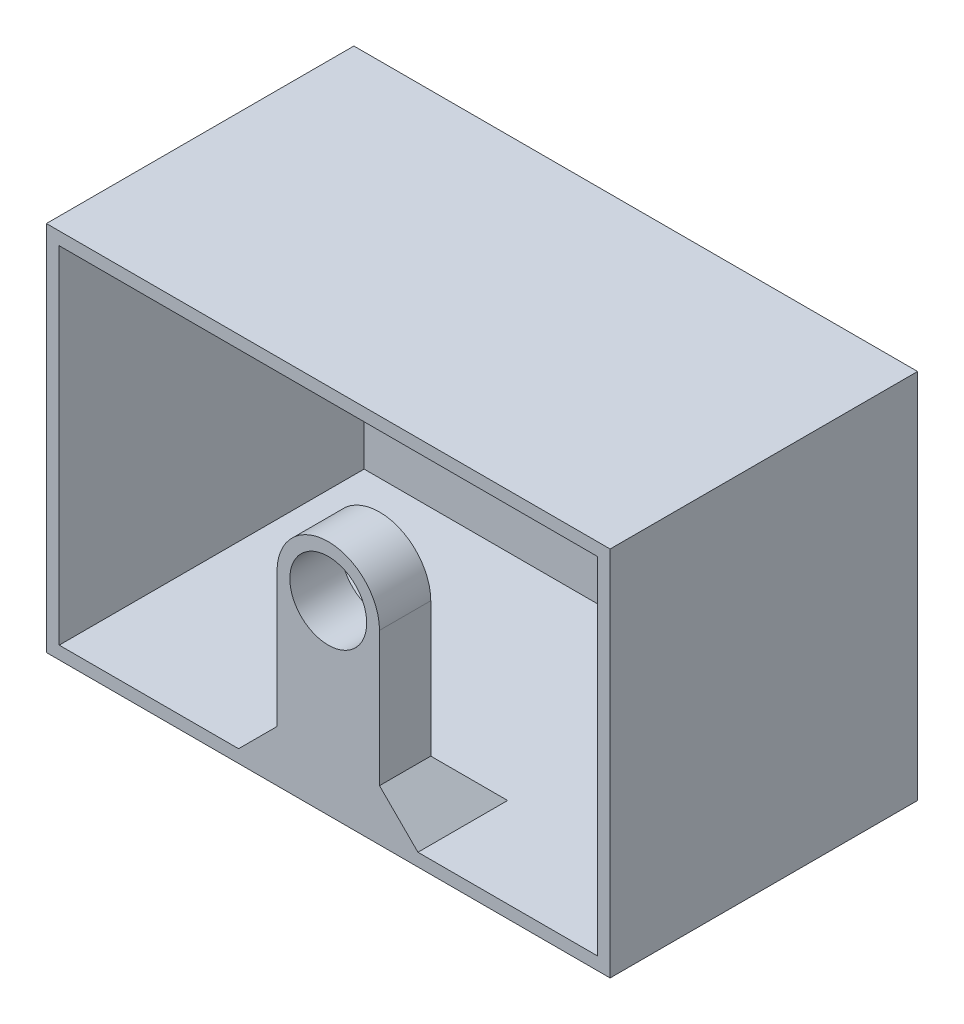
ISO-10303-21;
HEADER;
FILE_DESCRIPTION(('STEP AP214'),'2;1');
FILE_NAME('part.step','',(''),(''),'','','');
FILE_SCHEMA(('AUTOMOTIVE_DESIGN { 1 0 10303 214 1 1 1 1 }'));
ENDSEC;
DATA;
#1=APPLICATION_CONTEXT('core data for automotive mechanical design processes');
#2=APPLICATION_PROTOCOL_DEFINITION('international standard','automotive_design',2000,#1);
#3=PRODUCT_CONTEXT('',#1,'mechanical');
#4=PRODUCT('Part','Part','',(#3));
#5=PRODUCT_RELATED_PRODUCT_CATEGORY('part','',(#4));
#6=PRODUCT_DEFINITION_FORMATION('','',#4);
#7=PRODUCT_DEFINITION_CONTEXT('part definition',#1,'design');
#8=PRODUCT_DEFINITION('design','',#6,#7);
#9=PRODUCT_DEFINITION_SHAPE('','',#8);
#10=(LENGTH_UNIT() NAMED_UNIT(*) SI_UNIT(.MILLI.,.METRE.));
#11=(NAMED_UNIT(*) PLANE_ANGLE_UNIT() SI_UNIT($,.RADIAN.));
#12=(NAMED_UNIT(*) SI_UNIT($,.STERADIAN.) SOLID_ANGLE_UNIT());
#13=UNCERTAINTY_MEASURE_WITH_UNIT(LENGTH_MEASURE(1.E-05),#10,'distance_accuracy_value','');
#14=(GEOMETRIC_REPRESENTATION_CONTEXT(3) GLOBAL_UNCERTAINTY_ASSIGNED_CONTEXT((#13)) GLOBAL_UNIT_ASSIGNED_CONTEXT((#10,
#11,#12)) REPRESENTATION_CONTEXT('',''));
#15=CARTESIAN_POINT('',(0.,0.,0.));
#16=DIRECTION('',(0.,0.,1.));
#17=DIRECTION('',(1.,0.,0.));
#18=AXIS2_PLACEMENT_3D('',#15,#16,#17);
#19=CARTESIAN_POINT('',(0.,-67.5,60.));
#20=DIRECTION('',(0.,1.,0.));
#21=DIRECTION('',(0.,0.,1.));
#22=AXIS2_PLACEMENT_3D('',#19,#20,#21);
#23=PLANE('',#22);
#24=DIRECTION('',(1.,0.,0.));
#25=VECTOR('',#24,1.);
#26=CARTESIAN_POINT('',(0.,-67.5,24.9999999999999));
#27=LINE('',#26,#25);
#28=CARTESIAN_POINT('',(-35.0000000000001,-67.5,24.9999999999999));
#29=VERTEX_POINT('',#28);
#30=CARTESIAN_POINT('',(35.0000000000001,-67.5,24.9999999999999));
#31=VERTEX_POINT('',#30);
#32=EDGE_CURVE('E273',#29,#31,#27,.T.);
#33=ORIENTED_EDGE('',*,*,#32,.T.);
#34=DIRECTION('',(0.,0.,1.));
#35=VECTOR('',#34,1.);
#36=CARTESIAN_POINT('',(35.0000000000001,-67.5,60.));
#37=LINE('',#36,#35);
#38=CARTESIAN_POINT('',(35.0000000000001,-67.5,60.));
#39=VERTEX_POINT('',#38);
#40=EDGE_CURVE('E293',#31,#39,#37,.T.);
#41=ORIENTED_EDGE('',*,*,#40,.T.);
#42=DIRECTION('',(1.,0.,0.));
#43=VECTOR('',#42,1.);
#44=CARTESIAN_POINT('',(0.,-67.5,60.));
#45=LINE('',#44,#43);
#46=CARTESIAN_POINT('',(105.,-67.5,60.));
#47=VERTEX_POINT('',#46);
#48=EDGE_CURVE('E220',#39,#47,#45,.T.);
#49=ORIENTED_EDGE('',*,*,#48,.T.);
#50=DIRECTION('',(0.,0.,-1.));
#51=VECTOR('',#50,1.);
#52=CARTESIAN_POINT('',(105.,-67.5,60.));
#53=LINE('',#52,#51);
#54=CARTESIAN_POINT('',(105.,-67.5,-59.));
#55=VERTEX_POINT('',#54);
#56=EDGE_CURVE('E243',#47,#55,#53,.T.);
#57=ORIENTED_EDGE('',*,*,#56,.T.);
#58=DIRECTION('',(1.,0.,0.));
#59=VECTOR('',#58,1.);
#60=CARTESIAN_POINT('',(0.,-67.5,-59.));
#61=LINE('',#60,#59);
#62=CARTESIAN_POINT('',(-105.,-67.5,-59.));
#63=VERTEX_POINT('',#62);
#64=EDGE_CURVE('E199',#63,#55,#61,.T.);
#65=ORIENTED_EDGE('',*,*,#64,.F.);
#66=DIRECTION('',(0.,0.,-1.));
#67=VECTOR('',#66,1.);
#68=CARTESIAN_POINT('',(-105.,-67.5,60.));
#69=LINE('',#68,#67);
#70=CARTESIAN_POINT('',(-105.,-67.5,60.));
#71=VERTEX_POINT('',#70);
#72=EDGE_CURVE('E261',#71,#63,#69,.T.);
#73=ORIENTED_EDGE('',*,*,#72,.F.);
#74=CARTESIAN_POINT('',(-35.0000000000001,-67.5,60.));
#75=VERTEX_POINT('',#74);
#76=EDGE_CURVE('E215',#71,#75,#45,.T.);
#77=ORIENTED_EDGE('',*,*,#76,.T.);
#78=DIRECTION('',(0.,0.,-1.));
#79=VECTOR('',#78,1.);
#80=CARTESIAN_POINT('',(-35.0000000000001,-67.5,40.));
#81=LINE('',#80,#79);
#82=EDGE_CURVE('E290',#75,#29,#81,.T.);
#83=ORIENTED_EDGE('',*,*,#82,.T.);
#84=EDGE_LOOP('',(#33,#41,#49,#57,#65,#73,#77,#83));
#85=FACE_BOUND('',#84,.T.);
#86=ADVANCED_FACE('F51',(#85),#23,.T.);
#87=CARTESIAN_POINT('',(-105.,0.,60.));
#88=DIRECTION('',(-1.,0.,0.));
#89=DIRECTION('',(0.,0.,1.));
#90=AXIS2_PLACEMENT_3D('',#87,#88,#89);
#91=PLANE('',#90);
#92=DIRECTION('',(0.,-1.,0.));
#93=VECTOR('',#92,1.);
#94=CARTESIAN_POINT('',(-105.,0.,-59.));
#95=LINE('',#94,#93);
#96=CARTESIAN_POINT('',(-105.,67.5,-59.));
#97=VERTEX_POINT('',#96);
#98=EDGE_CURVE('E202',#97,#63,#95,.T.);
#99=ORIENTED_EDGE('',*,*,#98,.F.);
#100=DIRECTION('',(0.,0.,-1.));
#101=VECTOR('',#100,1.);
#102=CARTESIAN_POINT('',(-105.,67.5,60.));
#103=LINE('',#102,#101);
#104=CARTESIAN_POINT('',(-105.,67.5,60.));
#105=VERTEX_POINT('',#104);
#106=EDGE_CURVE('E281',#105,#97,#103,.T.);
#107=ORIENTED_EDGE('',*,*,#106,.F.);
#108=DIRECTION('',(0.,1.,0.));
#109=VECTOR('',#108,1.);
#110=CARTESIAN_POINT('',(-105.,0.,60.));
#111=LINE('',#110,#109);
#112=EDGE_CURVE('E219',#71,#105,#111,.T.);
#113=ORIENTED_EDGE('',*,*,#112,.F.);
#114=ORIENTED_EDGE('',*,*,#72,.T.);
#115=EDGE_LOOP('',(#99,#107,#113,#114));
#116=FACE_BOUND('',#115,.T.);
#117=ADVANCED_FACE('F338',(#116),#91,.F.);
#118=CARTESIAN_POINT('',(0.,67.5,60.));
#119=DIRECTION('',(0.,1.,0.));
#120=DIRECTION('',(0.,0.,1.));
#121=AXIS2_PLACEMENT_3D('',#118,#119,#120);
#122=PLANE('',#121);
#123=DIRECTION('',(-1.,0.,0.));
#124=VECTOR('',#123,1.);
#125=CARTESIAN_POINT('',(0.,67.5,-59.));
#126=LINE('',#125,#124);
#127=CARTESIAN_POINT('',(105.,67.5,-59.));
#128=VERTEX_POINT('',#127);
#129=EDGE_CURVE('E205',#128,#97,#126,.T.);
#130=ORIENTED_EDGE('',*,*,#129,.F.);
#131=DIRECTION('',(0.,0.,-1.));
#132=VECTOR('',#131,1.);
#133=CARTESIAN_POINT('',(105.,67.5,60.));
#134=LINE('',#133,#132);
#135=CARTESIAN_POINT('',(105.,67.5,60.));
#136=VERTEX_POINT('',#135);
#137=EDGE_CURVE('E277',#136,#128,#134,.T.);
#138=ORIENTED_EDGE('',*,*,#137,.F.);
#139=DIRECTION('',(1.,0.,0.));
#140=VECTOR('',#139,1.);
#141=CARTESIAN_POINT('',(0.,67.5,60.));
#142=LINE('',#141,#140);
#143=EDGE_CURVE('E223',#105,#136,#142,.T.);
#144=ORIENTED_EDGE('',*,*,#143,.F.);
#145=ORIENTED_EDGE('',*,*,#106,.T.);
#146=EDGE_LOOP('',(#130,#138,#144,#145));
#147=FACE_BOUND('',#146,.T.);
#148=ADVANCED_FACE('F345',(#147),#122,.F.);
#149=CARTESIAN_POINT('',(105.,0.,60.));
#150=DIRECTION('',(-1.,0.,0.));
#151=DIRECTION('',(0.,0.,1.));
#152=AXIS2_PLACEMENT_3D('',#149,#150,#151);
#153=PLANE('',#152);
#154=ORIENTED_EDGE('',*,*,#137,.T.);
#155=DIRECTION('',(0.,1.,0.));
#156=VECTOR('',#155,1.);
#157=CARTESIAN_POINT('',(105.,0.,-59.));
#158=LINE('',#157,#156);
#159=EDGE_CURVE('E208',#55,#128,#158,.T.);
#160=ORIENTED_EDGE('',*,*,#159,.F.);
#161=ORIENTED_EDGE('',*,*,#56,.F.);
#162=DIRECTION('',(0.,1.,0.));
#163=VECTOR('',#162,1.);
#164=CARTESIAN_POINT('',(105.,0.,60.));
#165=LINE('',#164,#163);
#166=EDGE_CURVE('E226',#47,#136,#165,.T.);
#167=ORIENTED_EDGE('',*,*,#166,.T.);
#168=EDGE_LOOP('',(#154,#160,#161,#167));
#169=FACE_BOUND('',#168,.T.);
#170=ADVANCED_FACE('F445',(#169),#153,.T.);
#171=CARTESIAN_POINT('',(-110.,0.,60.));
#172=DIRECTION('',(1.,0.,0.));
#173=DIRECTION('',(0.,1.,0.));
#174=AXIS2_PLACEMENT_3D('',#171,#172,#173);
#175=PLANE('',#174);
#176=DIRECTION('',(0.,-1.,0.));
#177=VECTOR('',#176,1.);
#178=CARTESIAN_POINT('',(-110.,0.,-60.));
#179=LINE('',#178,#177);
#180=CARTESIAN_POINT('',(-110.,72.5,-60.));
#181=VERTEX_POINT('',#180);
#182=CARTESIAN_POINT('',(-110.,-72.5,-60.));
#183=VERTEX_POINT('',#182);
#184=EDGE_CURVE('E211',#181,#183,#179,.T.);
#185=ORIENTED_EDGE('',*,*,#184,.T.);
#186=DIRECTION('',(0.,0.,-1.));
#187=VECTOR('',#186,1.);
#188=CARTESIAN_POINT('',(-110.,-72.5,60.));
#189=LINE('',#188,#187);
#190=CARTESIAN_POINT('',(-110.,-72.5,60.));
#191=VERTEX_POINT('',#190);
#192=EDGE_CURVE('E269',#191,#183,#189,.T.);
#193=ORIENTED_EDGE('',*,*,#192,.F.);
#194=DIRECTION('',(0.,-1.,0.));
#195=VECTOR('',#194,1.);
#196=CARTESIAN_POINT('',(-110.,0.,60.));
#197=LINE('',#196,#195);
#198=CARTESIAN_POINT('',(-110.,72.5,60.));
#199=VERTEX_POINT('',#198);
#200=EDGE_CURVE('E230',#199,#191,#197,.T.);
#201=ORIENTED_EDGE('',*,*,#200,.F.);
#202=DIRECTION('',(0.,0.,-1.));
#203=VECTOR('',#202,1.);
#204=CARTESIAN_POINT('',(-110.,72.5,60.));
#205=LINE('',#204,#203);
#206=EDGE_CURVE('E256',#199,#181,#205,.T.);
#207=ORIENTED_EDGE('',*,*,#206,.T.);
#208=EDGE_LOOP('',(#185,#193,#201,#207));
#209=FACE_BOUND('',#208,.T.);
#210=ADVANCED_FACE('F454',(#209),#175,.F.);
#211=CARTESIAN_POINT('',(0.,-72.5,60.));
#212=DIRECTION('',(0.,1.,0.));
#213=DIRECTION('',(0.,0.,1.));
#214=AXIS2_PLACEMENT_3D('',#211,#212,#213);
#215=PLANE('',#214);
#216=DIRECTION('',(1.,0.,0.));
#217=VECTOR('',#216,1.);
#218=CARTESIAN_POINT('',(0.,-72.5,-60.));
#219=LINE('',#218,#217);
#220=CARTESIAN_POINT('',(110.,-72.5,-60.));
#221=VERTEX_POINT('',#220);
#222=EDGE_CURVE('E247',#183,#221,#219,.T.);
#223=ORIENTED_EDGE('',*,*,#222,.T.);
#224=DIRECTION('',(0.,0.,-1.));
#225=VECTOR('',#224,1.);
#226=CARTESIAN_POINT('',(110.,-72.5,60.));
#227=LINE('',#226,#225);
#228=CARTESIAN_POINT('',(110.,-72.5,60.));
#229=VERTEX_POINT('',#228);
#230=EDGE_CURVE('E265',#229,#221,#227,.T.);
#231=ORIENTED_EDGE('',*,*,#230,.F.);
#232=DIRECTION('',(1.,0.,0.));
#233=VECTOR('',#232,1.);
#234=CARTESIAN_POINT('',(0.,-72.5,60.));
#235=LINE('',#234,#233);
#236=EDGE_CURVE('E234',#191,#229,#235,.T.);
#237=ORIENTED_EDGE('',*,*,#236,.F.);
#238=ORIENTED_EDGE('',*,*,#192,.T.);
#239=EDGE_LOOP('',(#223,#231,#237,#238));
#240=FACE_BOUND('',#239,.T.);
#241=ADVANCED_FACE('F489',(#240),#215,.F.);
#242=CARTESIAN_POINT('',(110.,0.,60.));
#243=DIRECTION('',(-1.,0.,0.));
#244=DIRECTION('',(0.,-1.,0.));
#245=AXIS2_PLACEMENT_3D('',#242,#243,#244);
#246=PLANE('',#245);
#247=DIRECTION('',(0.,1.,0.));
#248=VECTOR('',#247,1.);
#249=CARTESIAN_POINT('',(110.,0.,-60.));
#250=LINE('',#249,#248);
#251=CARTESIAN_POINT('',(110.,72.5,-60.));
#252=VERTEX_POINT('',#251);
#253=EDGE_CURVE('E250',#221,#252,#250,.T.);
#254=ORIENTED_EDGE('',*,*,#253,.T.);
#255=DIRECTION('',(0.,0.,-1.));
#256=VECTOR('',#255,1.);
#257=CARTESIAN_POINT('',(110.,72.5,60.));
#258=LINE('',#257,#256);
#259=CARTESIAN_POINT('',(110.,72.5,60.));
#260=VERTEX_POINT('',#259);
#261=EDGE_CURVE('E260',#260,#252,#258,.T.);
#262=ORIENTED_EDGE('',*,*,#261,.F.);
#263=DIRECTION('',(0.,1.,0.));
#264=VECTOR('',#263,1.);
#265=CARTESIAN_POINT('',(110.,0.,60.));
#266=LINE('',#265,#264);
#267=EDGE_CURVE('E237',#229,#260,#266,.T.);
#268=ORIENTED_EDGE('',*,*,#267,.F.);
#269=ORIENTED_EDGE('',*,*,#230,.T.);
#270=EDGE_LOOP('',(#254,#262,#268,#269));
#271=FACE_BOUND('',#270,.T.);
#272=ADVANCED_FACE('F480',(#271),#246,.F.);
#273=CARTESIAN_POINT('',(0.,72.5,60.));
#274=DIRECTION('',(0.,-1.,0.));
#275=DIRECTION('',(0.,0.,-1.));
#276=AXIS2_PLACEMENT_3D('',#273,#274,#275);
#277=PLANE('',#276);
#278=DIRECTION('',(-1.,0.,0.));
#279=VECTOR('',#278,1.);
#280=CARTESIAN_POINT('',(0.,72.5,-60.));
#281=LINE('',#280,#279);
#282=EDGE_CURVE('E253',#252,#181,#281,.T.);
#283=ORIENTED_EDGE('',*,*,#282,.T.);
#284=ORIENTED_EDGE('',*,*,#206,.F.);
#285=DIRECTION('',(-1.,0.,0.));
#286=VECTOR('',#285,1.);
#287=CARTESIAN_POINT('',(0.,72.5,60.));
#288=LINE('',#287,#286);
#289=EDGE_CURVE('E240',#260,#199,#288,.T.);
#290=ORIENTED_EDGE('',*,*,#289,.F.);
#291=ORIENTED_EDGE('',*,*,#261,.T.);
#292=EDGE_LOOP('',(#283,#284,#290,#291));
#293=FACE_BOUND('',#292,.T.);
#294=ADVANCED_FACE('F472',(#293),#277,.F.);
#295=CARTESIAN_POINT('',(0.,0.,60.));
#296=DIRECTION('',(0.,0.,1.));
#297=DIRECTION('',(1.,0.,0.));
#298=AXIS2_PLACEMENT_3D('',#295,#296,#297);
#299=PLANE('',#298);
#300=ORIENTED_EDGE('',*,*,#76,.F.);
#301=ORIENTED_EDGE('',*,*,#112,.T.);
#302=ORIENTED_EDGE('',*,*,#143,.T.);
#303=ORIENTED_EDGE('',*,*,#166,.F.);
#304=ORIENTED_EDGE('',*,*,#48,.F.);
#305=DIRECTION('',(0.707106781186551,-0.707106781186544,0.));
#306=VECTOR('',#305,1.);
#307=CARTESIAN_POINT('',(35.0000000000001,-67.5,60.));
#308=LINE('',#307,#306);
#309=CARTESIAN_POINT('',(20.,-52.5,60.));
#310=VERTEX_POINT('',#309);
#311=EDGE_CURVE('E62',#39,#310,#308,.F.);
#312=ORIENTED_EDGE('',*,*,#311,.T.);
#313=DIRECTION('',(0.,1.,0.));
#314=VECTOR('',#313,1.);
#315=CARTESIAN_POINT('',(20.,0.,60.));
#316=LINE('',#315,#314);
#317=CARTESIAN_POINT('',(20.,0.,60.));
#318=VERTEX_POINT('',#317);
#319=EDGE_CURVE('E176',#310,#318,#316,.T.);
#320=ORIENTED_EDGE('',*,*,#319,.T.);
#321=CARTESIAN_POINT('',(0.,0.,60.));
#322=DIRECTION('',(0.,0.,1.));
#323=DIRECTION('',(1.,0.,0.));
#324=AXIS2_PLACEMENT_3D('',#321,#322,#323);
#325=CIRCLE('',#324,20.);
#326=CARTESIAN_POINT('',(-20.,0.,60.));
#327=VERTEX_POINT('',#326);
#328=EDGE_CURVE('E186',#318,#327,#325,.T.);
#329=ORIENTED_EDGE('',*,*,#328,.T.);
#330=DIRECTION('',(0.,-1.,0.));
#331=VECTOR('',#330,1.);
#332=CARTESIAN_POINT('',(-20.,0.,60.));
#333=LINE('',#332,#331);
#334=CARTESIAN_POINT('',(-20.,-52.5,60.));
#335=VERTEX_POINT('',#334);
#336=EDGE_CURVE('E158',#327,#335,#333,.T.);
#337=ORIENTED_EDGE('',*,*,#336,.T.);
#338=DIRECTION('',(0.707106781186551,0.707106781186544,0.));
#339=VECTOR('',#338,1.);
#340=CARTESIAN_POINT('',(-20.,-52.5,60.));
#341=LINE('',#340,#339);
#342=EDGE_CURVE('E11',#335,#75,#341,.F.);
#343=ORIENTED_EDGE('',*,*,#342,.T.);
#344=EDGE_LOOP('',(#300,#301,#302,#303,#304,#312,#320,#329,#337,#343));
#345=FACE_BOUND('',#344,.T.);
#346=ORIENTED_EDGE('',*,*,#200,.T.);
#347=ORIENTED_EDGE('',*,*,#236,.T.);
#348=ORIENTED_EDGE('',*,*,#267,.T.);
#349=ORIENTED_EDGE('',*,*,#289,.T.);
#350=EDGE_LOOP('',(#346,#347,#348,#349));
#351=FACE_BOUND('',#350,.T.);
#352=CARTESIAN_POINT('',(0.,0.,60.));
#353=DIRECTION('',(0.,0.,1.));
#354=DIRECTION('',(1.,0.,0.));
#355=AXIS2_PLACEMENT_3D('',#352,#353,#354);
#356=CIRCLE('',#355,15.);
#357=CARTESIAN_POINT('',(15.,0.,60.));
#358=VERTEX_POINT('',#357);
#359=EDGE_CURVE('E181',#358,#358,#356,.T.);
#360=ORIENTED_EDGE('',*,*,#359,.F.);
#361=EDGE_LOOP('',(#360));
#362=FACE_BOUND('',#361,.T.);
#363=ADVANCED_FACE('F464',(#345,#351,#362),#299,.T.);
#364=CARTESIAN_POINT('',(0.,0.,-60.));
#365=DIRECTION('',(0.,0.,1.));
#366=DIRECTION('',(1.,0.,0.));
#367=AXIS2_PLACEMENT_3D('',#364,#365,#366);
#368=PLANE('',#367);
#369=ORIENTED_EDGE('',*,*,#184,.F.);
#370=ORIENTED_EDGE('',*,*,#282,.F.);
#371=ORIENTED_EDGE('',*,*,#253,.F.);
#372=ORIENTED_EDGE('',*,*,#222,.F.);
#373=EDGE_LOOP('',(#369,#370,#371,#372));
#374=FACE_BOUND('',#373,.T.);
#375=CARTESIAN_POINT('',(0.,0.,-60.));
#376=DIRECTION('',(0.,0.,-1.));
#377=DIRECTION('',(-1.,0.,0.));
#378=AXIS2_PLACEMENT_3D('',#375,#376,#377);
#379=CIRCLE('',#378,15.);
#380=CARTESIAN_POINT('',(-15.,0.,-60.));
#381=VERTEX_POINT('',#380);
#382=EDGE_CURVE('E193',#381,#381,#379,.T.);
#383=ORIENTED_EDGE('',*,*,#382,.F.);
#384=EDGE_LOOP('',(#383));
#385=FACE_BOUND('',#384,.T.);
#386=ADVANCED_FACE('F423',(#374,#385),#368,.F.);
#387=CARTESIAN_POINT('',(0.,0.,-59.));
#388=DIRECTION('',(0.,0.,-1.));
#389=DIRECTION('',(-1.,0.,0.));
#390=AXIS2_PLACEMENT_3D('',#387,#388,#389);
#391=CYLINDRICAL_SURFACE('',#390,15.);
#392=CARTESIAN_POINT('',(0.,0.,-59.));
#393=DIRECTION('',(0.,0.,-1.));
#394=DIRECTION('',(-1.,0.,0.));
#395=AXIS2_PLACEMENT_3D('',#392,#393,#394);
#396=CIRCLE('',#395,15.);
#397=CARTESIAN_POINT('',(-15.,0.,-59.));
#398=VERTEX_POINT('',#397);
#399=EDGE_CURVE('E195',#398,#398,#396,.T.);
#400=ORIENTED_EDGE('',*,*,#399,.F.);
#401=EDGE_LOOP('',(#400));
#402=FACE_BOUND('',#401,.T.);
#403=ORIENTED_EDGE('',*,*,#382,.T.);
#404=EDGE_LOOP('',(#403));
#405=FACE_BOUND('',#404,.T.);
#406=ADVANCED_FACE('F415',(#402,#405),#391,.F.);
#407=CARTESIAN_POINT('',(0.,0.,-59.));
#408=DIRECTION('',(0.,0.,-1.));
#409=DIRECTION('',(-1.,0.,0.));
#410=AXIS2_PLACEMENT_3D('',#407,#408,#409);
#411=PLANE('',#410);
#412=ORIENTED_EDGE('',*,*,#399,.T.);
#413=EDGE_LOOP('',(#412));
#414=FACE_BOUND('',#413,.T.);
#415=ORIENTED_EDGE('',*,*,#64,.T.);
#416=ORIENTED_EDGE('',*,*,#159,.T.);
#417=ORIENTED_EDGE('',*,*,#129,.T.);
#418=ORIENTED_EDGE('',*,*,#98,.T.);
#419=EDGE_LOOP('',(#415,#416,#417,#418));
#420=FACE_BOUND('',#419,.T.);
#421=ADVANCED_FACE('F406',(#414,#420),#411,.F.);
#422=CARTESIAN_POINT('',(0.,0.,40.));
#423=DIRECTION('',(0.,0.,1.));
#424=DIRECTION('',(1.,0.,0.));
#425=AXIS2_PLACEMENT_3D('',#422,#423,#424);
#426=CYLINDRICAL_SURFACE('',#425,20.);
#427=ORIENTED_EDGE('',*,*,#328,.F.);
#428=DIRECTION('',(0.,0.,1.));
#429=VECTOR('',#428,1.);
#430=CARTESIAN_POINT('',(20.,0.,40.));
#431=LINE('',#430,#429);
#432=CARTESIAN_POINT('',(20.,0.,40.));
#433=VERTEX_POINT('',#432);
#434=EDGE_CURVE('E164',#433,#318,#431,.T.);
#435=ORIENTED_EDGE('',*,*,#434,.F.);
#436=CARTESIAN_POINT('',(0.,0.,40.));
#437=DIRECTION('',(0.,0.,1.));
#438=DIRECTION('',(1.,0.,0.));
#439=AXIS2_PLACEMENT_3D('',#436,#437,#438);
#440=CIRCLE('',#439,20.);
#441=CARTESIAN_POINT('',(-20.,0.,40.));
#442=VERTEX_POINT('',#441);
#443=EDGE_CURVE('E169',#433,#442,#440,.T.);
#444=ORIENTED_EDGE('',*,*,#443,.T.);
#445=DIRECTION('',(0.,0.,1.));
#446=VECTOR('',#445,1.);
#447=CARTESIAN_POINT('',(-20.,0.,40.));
#448=LINE('',#447,#446);
#449=EDGE_CURVE('E155',#442,#327,#448,.T.);
#450=ORIENTED_EDGE('',*,*,#449,.T.);
#451=EDGE_LOOP('',(#427,#435,#444,#450));
#452=FACE_BOUND('',#451,.T.);
#453=ADVANCED_FACE('F173',(#452),#426,.T.);
#454=CARTESIAN_POINT('',(20.,0.,40.));
#455=DIRECTION('',(1.,0.,0.));
#456=DIRECTION('',(0.,1.,0.));
#457=AXIS2_PLACEMENT_3D('',#454,#455,#456);
#458=PLANE('',#457);
#459=ORIENTED_EDGE('',*,*,#319,.F.);
#460=DIRECTION('',(0.,0.,-1.));
#461=VECTOR('',#460,1.);
#462=CARTESIAN_POINT('',(20.,-52.5,40.));
#463=LINE('',#462,#461);
#464=CARTESIAN_POINT('',(20.,-52.5,40.));
#465=VERTEX_POINT('',#464);
#466=EDGE_CURVE('E297',#310,#465,#463,.T.);
#467=ORIENTED_EDGE('',*,*,#466,.T.);
#468=DIRECTION('',(0.,1.,0.));
#469=VECTOR('',#468,1.);
#470=CARTESIAN_POINT('',(20.,0.,40.));
#471=LINE('',#470,#469);
#472=EDGE_CURVE('E165',#465,#433,#471,.T.);
#473=ORIENTED_EDGE('',*,*,#472,.T.);
#474=ORIENTED_EDGE('',*,*,#434,.T.);
#475=EDGE_LOOP('',(#459,#467,#473,#474));
#476=FACE_BOUND('',#475,.T.);
#477=ADVANCED_FACE('F391',(#476),#458,.T.);
#478=CARTESIAN_POINT('',(-20.,0.,40.));
#479=DIRECTION('',(-1.,0.,0.));
#480=DIRECTION('',(0.,-1.,0.));
#481=AXIS2_PLACEMENT_3D('',#478,#479,#480);
#482=PLANE('',#481);
#483=DIRECTION('',(0.,-1.,0.));
#484=VECTOR('',#483,1.);
#485=CARTESIAN_POINT('',(-20.,0.,40.));
#486=LINE('',#485,#484);
#487=CARTESIAN_POINT('',(-20.,-52.5,40.));
#488=VERTEX_POINT('',#487);
#489=EDGE_CURVE('E157',#442,#488,#486,.T.);
#490=ORIENTED_EDGE('',*,*,#489,.T.);
#491=DIRECTION('',(0.,0.,1.));
#492=VECTOR('',#491,1.);
#493=CARTESIAN_POINT('',(-20.,-52.5,60.));
#494=LINE('',#493,#492);
#495=EDGE_CURVE('E77',#488,#335,#494,.T.);
#496=ORIENTED_EDGE('',*,*,#495,.T.);
#497=ORIENTED_EDGE('',*,*,#336,.F.);
#498=ORIENTED_EDGE('',*,*,#449,.F.);
#499=EDGE_LOOP('',(#490,#496,#497,#498));
#500=FACE_BOUND('',#499,.T.);
#501=ADVANCED_FACE('F156',(#500),#482,.T.);
#502=CARTESIAN_POINT('',(0.,0.,40.));
#503=DIRECTION('',(0.,0.,1.));
#504=DIRECTION('',(1.,0.,0.));
#505=AXIS2_PLACEMENT_3D('',#502,#503,#504);
#506=PLANE('',#505);
#507=CARTESIAN_POINT('',(0.,0.,40.));
#508=DIRECTION('',(0.,0.,1.));
#509=DIRECTION('',(1.,0.,0.));
#510=AXIS2_PLACEMENT_3D('',#507,#508,#509);
#511=CIRCLE('',#510,15.);
#512=CARTESIAN_POINT('',(15.,0.,40.));
#513=VERTEX_POINT('',#512);
#514=EDGE_CURVE('E189',#513,#513,#511,.T.);
#515=ORIENTED_EDGE('',*,*,#514,.T.);
#516=EDGE_LOOP('',(#515));
#517=FACE_BOUND('',#516,.T.);
#518=ORIENTED_EDGE('',*,*,#472,.F.);
#519=DIRECTION('',(-1.,0.,0.));
#520=VECTOR('',#519,1.);
#521=CARTESIAN_POINT('',(0.,-52.5,40.));
#522=LINE('',#521,#520);
#523=EDGE_CURVE('E70',#465,#488,#522,.T.);
#524=ORIENTED_EDGE('',*,*,#523,.T.);
#525=ORIENTED_EDGE('',*,*,#489,.F.);
#526=ORIENTED_EDGE('',*,*,#443,.F.);
#527=EDGE_LOOP('',(#518,#524,#525,#526));
#528=FACE_BOUND('',#527,.T.);
#529=ADVANCED_FACE('F168',(#517,#528),#506,.F.);
#530=CARTESIAN_POINT('',(0.,0.,40.));
#531=DIRECTION('',(0.,0.,1.));
#532=DIRECTION('',(1.,0.,0.));
#533=AXIS2_PLACEMENT_3D('',#530,#531,#532);
#534=CYLINDRICAL_SURFACE('',#533,15.);
#535=ORIENTED_EDGE('',*,*,#514,.F.);
#536=EDGE_LOOP('',(#535));
#537=FACE_BOUND('',#536,.T.);
#538=ORIENTED_EDGE('',*,*,#359,.T.);
#539=EDGE_LOOP('',(#538));
#540=FACE_BOUND('',#539,.T.);
#541=ADVANCED_FACE('F326',(#537,#540),#534,.F.);
#542=CARTESIAN_POINT('',(-20.,-52.5,40.));
#543=DIRECTION('',(-0.707106781186544,0.707106781186551,0.));
#544=DIRECTION('',(0.,0.,-1.));
#545=AXIS2_PLACEMENT_3D('',#542,#543,#544);
#546=PLANE('',#545);
#547=ORIENTED_EDGE('',*,*,#342,.F.);
#548=ORIENTED_EDGE('',*,*,#495,.F.);
#549=DIRECTION('',(-0.577350269189628,-0.577350269189622,-0.577350269189628));
#550=VECTOR('',#549,1.);
#551=CARTESIAN_POINT('',(-23.3333333333333,-55.8333333333333,36.6666666666667));
#552=LINE('',#551,#550);
#553=EDGE_CURVE('E56',#29,#488,#552,.F.);
#554=ORIENTED_EDGE('',*,*,#553,.F.);
#555=ORIENTED_EDGE('',*,*,#82,.F.);
#556=EDGE_LOOP('',(#547,#548,#554,#555));
#557=FACE_BOUND('',#556,.T.);
#558=ADVANCED_FACE('F54',(#557),#546,.T.);
#559=CARTESIAN_POINT('',(0.,-67.5,24.9999999999999));
#560=DIRECTION('',(0.,-0.707106781186551,0.707106781186544));
#561=DIRECTION('',(1.,0.,0.));
#562=AXIS2_PLACEMENT_3D('',#559,#560,#561);
#563=PLANE('',#562);
#564=ORIENTED_EDGE('',*,*,#553,.T.);
#565=ORIENTED_EDGE('',*,*,#523,.F.);
#566=DIRECTION('',(-0.577350269189627,0.577350269189622,0.577350269189628));
#567=VECTOR('',#566,1.);
#568=CARTESIAN_POINT('',(23.3333333333333,-55.8333333333333,36.6666666666667));
#569=LINE('',#568,#567);
#570=EDGE_CURVE('E305',#31,#465,#569,.T.);
#571=ORIENTED_EDGE('',*,*,#570,.F.);
#572=ORIENTED_EDGE('',*,*,#32,.F.);
#573=EDGE_LOOP('',(#564,#565,#571,#572));
#574=FACE_BOUND('',#573,.T.);
#575=ADVANCED_FACE('F334',(#574),#563,.F.);
#576=CARTESIAN_POINT('',(35.0000000000001,-67.5,60.));
#577=DIRECTION('',(0.707106781186544,0.707106781186551,0.));
#578=DIRECTION('',(0.,0.,-1.));
#579=AXIS2_PLACEMENT_3D('',#576,#577,#578);
#580=PLANE('',#579);
#581=ORIENTED_EDGE('',*,*,#570,.T.);
#582=ORIENTED_EDGE('',*,*,#466,.F.);
#583=ORIENTED_EDGE('',*,*,#311,.F.);
#584=ORIENTED_EDGE('',*,*,#40,.F.);
#585=EDGE_LOOP('',(#581,#582,#583,#584));
#586=FACE_BOUND('',#585,.T.);
#587=ADVANCED_FACE('F351',(#586),#580,.T.);
#588=CLOSED_SHELL('',(#86,#117,#148,#170,#210,#241,#272,#294,#363,#386,#406,#421,#453,#477,#501,
#529,#541,#558,#575,#587));
#589=MANIFOLD_SOLID_BREP('B2',#588);
#590=ADVANCED_BREP_SHAPE_REPRESENTATION('',(#18,#589),#14);
#591=SHAPE_DEFINITION_REPRESENTATION(#9,#590);
ENDSEC;
END-ISO-10303-21;
